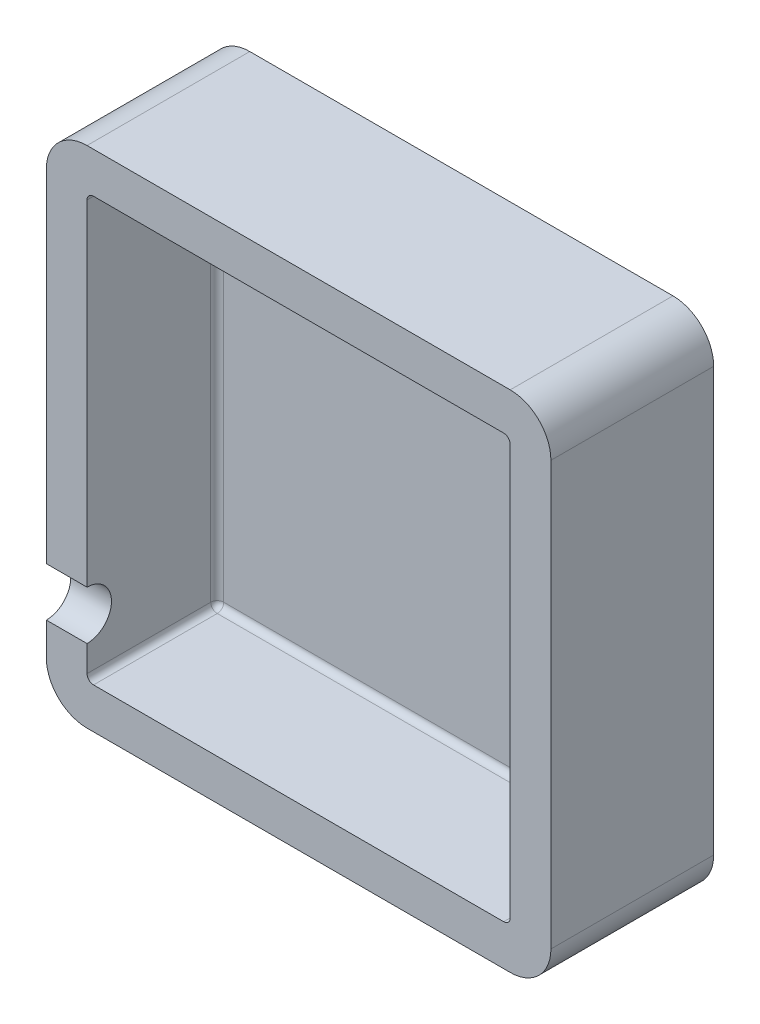
ISO-10303-21;
HEADER;
FILE_DESCRIPTION(('STEP AP214'),'2;1');
FILE_NAME('part.step','',(''),(''),'','','');
FILE_SCHEMA(('AUTOMOTIVE_DESIGN { 1 0 10303 214 1 1 1 1 }'));
ENDSEC;
DATA;
#1=APPLICATION_CONTEXT('core data for automotive mechanical design processes');
#2=APPLICATION_PROTOCOL_DEFINITION('international standard','automotive_design',2000,#1);
#3=PRODUCT_CONTEXT('',#1,'mechanical');
#4=PRODUCT('Part','Part','',(#3));
#5=PRODUCT_RELATED_PRODUCT_CATEGORY('part','',(#4));
#6=PRODUCT_DEFINITION_FORMATION('','',#4);
#7=PRODUCT_DEFINITION_CONTEXT('part definition',#1,'design');
#8=PRODUCT_DEFINITION('design','',#6,#7);
#9=PRODUCT_DEFINITION_SHAPE('','',#8);
#10=(LENGTH_UNIT() NAMED_UNIT(*) SI_UNIT(.MILLI.,.METRE.));
#11=(NAMED_UNIT(*) PLANE_ANGLE_UNIT() SI_UNIT($,.RADIAN.));
#12=(NAMED_UNIT(*) SI_UNIT($,.STERADIAN.) SOLID_ANGLE_UNIT());
#13=UNCERTAINTY_MEASURE_WITH_UNIT(LENGTH_MEASURE(1.E-05),#10,'distance_accuracy_value','');
#14=(GEOMETRIC_REPRESENTATION_CONTEXT(3) GLOBAL_UNCERTAINTY_ASSIGNED_CONTEXT((#13)) GLOBAL_UNIT_ASSIGNED_CONTEXT((#10,
#11,#12)) REPRESENTATION_CONTEXT('',''));
#15=CARTESIAN_POINT('',(0.,0.,0.));
#16=DIRECTION('',(0.,0.,1.));
#17=DIRECTION('',(1.,0.,0.));
#18=AXIS2_PLACEMENT_3D('',#15,#16,#17);
#19=CARTESIAN_POINT('',(0.,0.,8.));
#20=DIRECTION('',(0.,0.,1.));
#21=DIRECTION('',(1.,0.,0.));
#22=AXIS2_PLACEMENT_3D('',#19,#20,#21);
#23=PLANE('',#22);
#24=DIRECTION('',(-1.,0.,0.));
#25=VECTOR('',#24,1.);
#26=CARTESIAN_POINT('',(15.501,-8.,8.));
#27=LINE('',#26,#25);
#28=CARTESIAN_POINT('',(-15.5,-8.,8.));
#29=VERTEX_POINT('',#28);
#30=CARTESIAN_POINT('',(-13.,-8.,8.));
#31=VERTEX_POINT('',#30);
#32=EDGE_CURVE('E196',#29,#31,#27,.F.);
#33=ORIENTED_EDGE('',*,*,#32,.T.);
#34=DIRECTION('',(0.,-1.,0.));
#35=VECTOR('',#34,1.);
#36=CARTESIAN_POINT('',(-13.,-13.,8.));
#37=LINE('',#36,#35);
#38=CARTESIAN_POINT('',(-13.,12.6,8.));
#39=VERTEX_POINT('',#38);
#40=EDGE_CURVE('E355',#39,#31,#37,.T.);
#41=ORIENTED_EDGE('',*,*,#40,.F.);
#42=CARTESIAN_POINT('',(-12.6,12.6,8.));
#43=DIRECTION('',(0.,0.,1.));
#44=DIRECTION('',(1.,0.,0.));
#45=AXIS2_PLACEMENT_3D('',#42,#43,#44);
#46=CIRCLE('',#45,0.4);
#47=CARTESIAN_POINT('',(-12.6,13.,8.));
#48=VERTEX_POINT('',#47);
#49=EDGE_CURVE('E12',#39,#48,#46,.F.);
#50=ORIENTED_EDGE('',*,*,#49,.T.);
#51=DIRECTION('',(-1.,0.,0.));
#52=VECTOR('',#51,1.);
#53=CARTESIAN_POINT('',(13.,13.,8.));
#54=LINE('',#53,#52);
#55=CARTESIAN_POINT('',(12.6,13.,8.));
#56=VERTEX_POINT('',#55);
#57=EDGE_CURVE('E216',#56,#48,#54,.T.);
#58=ORIENTED_EDGE('',*,*,#57,.F.);
#59=CARTESIAN_POINT('',(12.6,12.6,8.));
#60=DIRECTION('',(0.,0.,1.));
#61=DIRECTION('',(1.,0.,0.));
#62=AXIS2_PLACEMENT_3D('',#59,#60,#61);
#63=CIRCLE('',#62,0.4);
#64=CARTESIAN_POINT('',(13.,12.6,8.));
#65=VERTEX_POINT('',#64);
#66=EDGE_CURVE('E66',#56,#65,#63,.F.);
#67=ORIENTED_EDGE('',*,*,#66,.T.);
#68=DIRECTION('',(0.,1.,0.));
#69=VECTOR('',#68,1.);
#70=CARTESIAN_POINT('',(13.,-13.,8.));
#71=LINE('',#70,#69);
#72=CARTESIAN_POINT('',(13.,-12.6,8.));
#73=VERTEX_POINT('',#72);
#74=EDGE_CURVE('E220',#73,#65,#71,.T.);
#75=ORIENTED_EDGE('',*,*,#74,.F.);
#76=CARTESIAN_POINT('',(12.6,-12.6,8.));
#77=DIRECTION('',(0.,0.,1.));
#78=DIRECTION('',(1.,0.,0.));
#79=AXIS2_PLACEMENT_3D('',#76,#77,#78);
#80=CIRCLE('',#79,0.4);
#81=CARTESIAN_POINT('',(12.6,-13.,8.));
#82=VERTEX_POINT('',#81);
#83=EDGE_CURVE('E302',#73,#82,#80,.F.);
#84=ORIENTED_EDGE('',*,*,#83,.T.);
#85=DIRECTION('',(1.,0.,0.));
#86=VECTOR('',#85,1.);
#87=CARTESIAN_POINT('',(13.,-13.,8.));
#88=LINE('',#87,#86);
#89=CARTESIAN_POINT('',(-12.6,-13.,8.));
#90=VERTEX_POINT('',#89);
#91=EDGE_CURVE('E358',#90,#82,#88,.T.);
#92=ORIENTED_EDGE('',*,*,#91,.F.);
#93=CARTESIAN_POINT('',(-12.6,-12.6,8.));
#94=DIRECTION('',(0.,0.,1.));
#95=DIRECTION('',(1.,0.,0.));
#96=AXIS2_PLACEMENT_3D('',#93,#94,#95);
#97=CIRCLE('',#96,0.4);
#98=CARTESIAN_POINT('',(-13.,-12.6,8.));
#99=VERTEX_POINT('',#98);
#100=EDGE_CURVE('E300',#90,#99,#97,.F.);
#101=ORIENTED_EDGE('',*,*,#100,.T.);
#102=CARTESIAN_POINT('',(-13.,-11.,8.));
#103=VERTEX_POINT('',#102);
#104=EDGE_CURVE('E208',#103,#99,#37,.T.);
#105=ORIENTED_EDGE('',*,*,#104,.F.);
#106=DIRECTION('',(-1.,0.,0.));
#107=VECTOR('',#106,1.);
#108=CARTESIAN_POINT('',(15.501,-11.,8.));
#109=LINE('',#108,#107);
#110=CARTESIAN_POINT('',(-15.5,-11.,8.));
#111=VERTEX_POINT('',#110);
#112=EDGE_CURVE('E74',#103,#111,#109,.T.);
#113=ORIENTED_EDGE('',*,*,#112,.T.);
#114=DIRECTION('',(0.,-1.,0.));
#115=VECTOR('',#114,1.);
#116=CARTESIAN_POINT('',(-15.5,-13.,8.));
#117=LINE('',#116,#115);
#118=CARTESIAN_POINT('',(-15.5,-13.,8.));
#119=VERTEX_POINT('',#118);
#120=EDGE_CURVE('E205',#111,#119,#117,.T.);
#121=ORIENTED_EDGE('',*,*,#120,.T.);
#122=CARTESIAN_POINT('',(-13.,-13.,8.));
#123=DIRECTION('',(0.,0.,1.));
#124=DIRECTION('',(1.,0.,0.));
#125=AXIS2_PLACEMENT_3D('',#122,#123,#124);
#126=CIRCLE('',#125,2.5);
#127=CARTESIAN_POINT('',(-13.,-15.5,8.));
#128=VERTEX_POINT('',#127);
#129=EDGE_CURVE('E252',#119,#128,#126,.T.);
#130=ORIENTED_EDGE('',*,*,#129,.T.);
#131=DIRECTION('',(1.,0.,0.));
#132=VECTOR('',#131,1.);
#133=CARTESIAN_POINT('',(13.,-15.5,8.));
#134=LINE('',#133,#132);
#135=CARTESIAN_POINT('',(13.,-15.5,8.));
#136=VERTEX_POINT('',#135);
#137=EDGE_CURVE('E218',#128,#136,#134,.T.);
#138=ORIENTED_EDGE('',*,*,#137,.T.);
#139=CARTESIAN_POINT('',(13.,-13.,8.));
#140=DIRECTION('',(0.,0.,1.));
#141=DIRECTION('',(1.,0.,0.));
#142=AXIS2_PLACEMENT_3D('',#139,#140,#141);
#143=CIRCLE('',#142,2.5);
#144=CARTESIAN_POINT('',(15.5,-13.,8.));
#145=VERTEX_POINT('',#144);
#146=EDGE_CURVE('E254',#136,#145,#143,.T.);
#147=ORIENTED_EDGE('',*,*,#146,.T.);
#148=DIRECTION('',(0.,1.,0.));
#149=VECTOR('',#148,1.);
#150=CARTESIAN_POINT('',(15.5,-13.,8.));
#151=LINE('',#150,#149);
#152=CARTESIAN_POINT('',(15.5,13.,8.));
#153=VERTEX_POINT('',#152);
#154=EDGE_CURVE('E226',#145,#153,#151,.T.);
#155=ORIENTED_EDGE('',*,*,#154,.T.);
#156=CARTESIAN_POINT('',(13.,13.,8.));
#157=DIRECTION('',(0.,0.,1.));
#158=DIRECTION('',(1.,0.,0.));
#159=AXIS2_PLACEMENT_3D('',#156,#157,#158);
#160=CIRCLE('',#159,2.5);
#161=CARTESIAN_POINT('',(13.,15.5,8.));
#162=VERTEX_POINT('',#161);
#163=EDGE_CURVE('E256',#153,#162,#160,.T.);
#164=ORIENTED_EDGE('',*,*,#163,.T.);
#165=DIRECTION('',(-1.,0.,0.));
#166=VECTOR('',#165,1.);
#167=CARTESIAN_POINT('',(13.,15.5,8.));
#168=LINE('',#167,#166);
#169=CARTESIAN_POINT('',(-13.,15.5,8.));
#170=VERTEX_POINT('',#169);
#171=EDGE_CURVE('E229',#162,#170,#168,.T.);
#172=ORIENTED_EDGE('',*,*,#171,.T.);
#173=CARTESIAN_POINT('',(-13.,13.,8.));
#174=DIRECTION('',(0.,0.,1.));
#175=DIRECTION('',(1.,0.,0.));
#176=AXIS2_PLACEMENT_3D('',#173,#174,#175);
#177=CIRCLE('',#176,2.5);
#178=CARTESIAN_POINT('',(-15.5,13.,8.));
#179=VERTEX_POINT('',#178);
#180=EDGE_CURVE('E250',#170,#179,#177,.T.);
#181=ORIENTED_EDGE('',*,*,#180,.T.);
#182=EDGE_CURVE('E215',#179,#29,#117,.T.);
#183=ORIENTED_EDGE('',*,*,#182,.T.);
#184=EDGE_LOOP('',(#33,#41,#50,#58,#67,#75,#84,#92,#101,#105,#113,#121,#130,#138,#147,#155,#164,
#172,#181,#183));
#185=FACE_BOUND('',#184,.T.);
#186=ADVANCED_FACE('F57',(#185),#23,.T.);
#187=CARTESIAN_POINT('',(-15.5,-13.,8.));
#188=DIRECTION('',(1.,0.,0.));
#189=DIRECTION('',(0.,0.,-1.));
#190=AXIS2_PLACEMENT_3D('',#187,#188,#189);
#191=PLANE('',#190);
#192=ORIENTED_EDGE('',*,*,#120,.F.);
#193=CARTESIAN_POINT('',(-15.5,-9.5,8.));
#194=DIRECTION('',(-1.,0.,0.));
#195=DIRECTION('',(0.,0.,1.));
#196=AXIS2_PLACEMENT_3D('',#193,#194,#195);
#197=CIRCLE('',#196,1.5);
#198=EDGE_CURVE('E193',#29,#111,#197,.T.);
#199=ORIENTED_EDGE('',*,*,#198,.F.);
#200=ORIENTED_EDGE('',*,*,#182,.F.);
#201=DIRECTION('',(0.,0.,-1.));
#202=VECTOR('',#201,1.);
#203=CARTESIAN_POINT('',(-15.5,13.,8.));
#204=LINE('',#203,#202);
#205=CARTESIAN_POINT('',(-15.5,13.,-2.));
#206=VERTEX_POINT('',#205);
#207=EDGE_CURVE('E263',#179,#206,#204,.T.);
#208=ORIENTED_EDGE('',*,*,#207,.T.);
#209=DIRECTION('',(0.,1.,0.));
#210=VECTOR('',#209,1.);
#211=CARTESIAN_POINT('',(-15.5,15.5,-2.));
#212=LINE('',#211,#210);
#213=CARTESIAN_POINT('',(-15.5,-13.,-2.));
#214=VERTEX_POINT('',#213);
#215=EDGE_CURVE('E346',#214,#206,#212,.T.);
#216=ORIENTED_EDGE('',*,*,#215,.F.);
#217=DIRECTION('',(0.,0.,-1.));
#218=VECTOR('',#217,1.);
#219=CARTESIAN_POINT('',(-15.5,-13.,8.));
#220=LINE('',#219,#218);
#221=EDGE_CURVE('E213',#214,#119,#220,.F.);
#222=ORIENTED_EDGE('',*,*,#221,.T.);
#223=EDGE_LOOP('',(#192,#199,#200,#208,#216,#222));
#224=FACE_BOUND('',#223,.T.);
#225=ADVANCED_FACE('F210',(#224),#191,.F.);
#226=CARTESIAN_POINT('',(13.,-15.5,8.));
#227=DIRECTION('',(0.,1.,0.));
#228=DIRECTION('',(-1.,0.,0.));
#229=AXIS2_PLACEMENT_3D('',#226,#227,#228);
#230=PLANE('',#229);
#231=DIRECTION('',(-1.,0.,0.));
#232=VECTOR('',#231,1.);
#233=CARTESIAN_POINT('',(15.5,-15.5,-2.));
#234=LINE('',#233,#232);
#235=CARTESIAN_POINT('',(13.,-15.5,-2.));
#236=VERTEX_POINT('',#235);
#237=CARTESIAN_POINT('',(-13.,-15.5,-2.));
#238=VERTEX_POINT('',#237);
#239=EDGE_CURVE('E341',#236,#238,#234,.T.);
#240=ORIENTED_EDGE('',*,*,#239,.F.);
#241=DIRECTION('',(0.,0.,-1.));
#242=VECTOR('',#241,1.);
#243=CARTESIAN_POINT('',(13.,-15.5,8.));
#244=LINE('',#243,#242);
#245=EDGE_CURVE('E261',#236,#136,#244,.F.);
#246=ORIENTED_EDGE('',*,*,#245,.T.);
#247=ORIENTED_EDGE('',*,*,#137,.F.);
#248=DIRECTION('',(0.,0.,-1.));
#249=VECTOR('',#248,1.);
#250=CARTESIAN_POINT('',(-13.,-15.5,8.));
#251=LINE('',#250,#249);
#252=EDGE_CURVE('E258',#128,#238,#251,.T.);
#253=ORIENTED_EDGE('',*,*,#252,.T.);
#254=EDGE_LOOP('',(#240,#246,#247,#253));
#255=FACE_BOUND('',#254,.T.);
#256=ADVANCED_FACE('F406',(#255),#230,.F.);
#257=CARTESIAN_POINT('',(15.5,-13.,8.));
#258=DIRECTION('',(-1.,0.,0.));
#259=DIRECTION('',(0.,0.,1.));
#260=AXIS2_PLACEMENT_3D('',#257,#258,#259);
#261=PLANE('',#260);
#262=DIRECTION('',(0.,-1.,0.));
#263=VECTOR('',#262,1.);
#264=CARTESIAN_POINT('',(15.5,15.5,-2.));
#265=LINE('',#264,#263);
#266=CARTESIAN_POINT('',(15.5,13.,-2.));
#267=VERTEX_POINT('',#266);
#268=CARTESIAN_POINT('',(15.5,-13.,-2.));
#269=VERTEX_POINT('',#268);
#270=EDGE_CURVE('E338',#267,#269,#265,.T.);
#271=ORIENTED_EDGE('',*,*,#270,.F.);
#272=DIRECTION('',(0.,0.,-1.));
#273=VECTOR('',#272,1.);
#274=CARTESIAN_POINT('',(15.5,13.,8.));
#275=LINE('',#274,#273);
#276=EDGE_CURVE('E248',#267,#153,#275,.F.);
#277=ORIENTED_EDGE('',*,*,#276,.T.);
#278=ORIENTED_EDGE('',*,*,#154,.F.);
#279=DIRECTION('',(0.,0.,-1.));
#280=VECTOR('',#279,1.);
#281=CARTESIAN_POINT('',(15.5,-13.,8.));
#282=LINE('',#281,#280);
#283=EDGE_CURVE('E245',#145,#269,#282,.T.);
#284=ORIENTED_EDGE('',*,*,#283,.T.);
#285=EDGE_LOOP('',(#271,#277,#278,#284));
#286=FACE_BOUND('',#285,.T.);
#287=ADVANCED_FACE('F415',(#286),#261,.F.);
#288=CARTESIAN_POINT('',(13.,15.5,8.));
#289=DIRECTION('',(0.,-1.,0.));
#290=DIRECTION('',(1.,0.,0.));
#291=AXIS2_PLACEMENT_3D('',#288,#289,#290);
#292=PLANE('',#291);
#293=ORIENTED_EDGE('',*,*,#171,.F.);
#294=DIRECTION('',(0.,0.,-1.));
#295=VECTOR('',#294,1.);
#296=CARTESIAN_POINT('',(13.,15.5,8.));
#297=LINE('',#296,#295);
#298=CARTESIAN_POINT('',(13.,15.5,-2.));
#299=VERTEX_POINT('',#298);
#300=EDGE_CURVE('E234',#162,#299,#297,.T.);
#301=ORIENTED_EDGE('',*,*,#300,.T.);
#302=DIRECTION('',(1.,0.,0.));
#303=VECTOR('',#302,1.);
#304=CARTESIAN_POINT('',(15.5,15.5,-2.));
#305=LINE('',#304,#303);
#306=CARTESIAN_POINT('',(-13.,15.5,-2.));
#307=VERTEX_POINT('',#306);
#308=EDGE_CURVE('E352',#307,#299,#305,.T.);
#309=ORIENTED_EDGE('',*,*,#308,.F.);
#310=DIRECTION('',(0.,0.,-1.));
#311=VECTOR('',#310,1.);
#312=CARTESIAN_POINT('',(-13.,15.5,8.));
#313=LINE('',#312,#311);
#314=EDGE_CURVE('E232',#307,#170,#313,.F.);
#315=ORIENTED_EDGE('',*,*,#314,.T.);
#316=EDGE_LOOP('',(#293,#301,#309,#315));
#317=FACE_BOUND('',#316,.T.);
#318=ADVANCED_FACE('F412',(#317),#292,.F.);
#319=CARTESIAN_POINT('',(-13.,-13.,8.));
#320=DIRECTION('',(1.,0.,0.));
#321=DIRECTION('',(0.,0.,-1.));
#322=AXIS2_PLACEMENT_3D('',#319,#320,#321);
#323=PLANE('',#322);
#324=CARTESIAN_POINT('',(-13.,-9.5,8.));
#325=DIRECTION('',(1.,0.,0.));
#326=DIRECTION('',(0.,0.,-1.));
#327=AXIS2_PLACEMENT_3D('',#324,#325,#326);
#328=CIRCLE('',#327,1.5);
#329=EDGE_CURVE('E201',#31,#103,#328,.F.);
#330=ORIENTED_EDGE('',*,*,#329,.T.);
#331=ORIENTED_EDGE('',*,*,#104,.T.);
#332=DIRECTION('',(0.,0.,-1.));
#333=VECTOR('',#332,1.);
#334=CARTESIAN_POINT('',(-13.,-12.6,0.));
#335=LINE('',#334,#333);
#336=CARTESIAN_POINT('',(-13.,-12.6,0.4));
#337=VERTEX_POINT('',#336);
#338=EDGE_CURVE('E281',#99,#337,#335,.T.);
#339=ORIENTED_EDGE('',*,*,#338,.T.);
#340=DIRECTION('',(0.,-1.,0.));
#341=VECTOR('',#340,1.);
#342=CARTESIAN_POINT('',(-13.,-13.,0.4));
#343=LINE('',#342,#341);
#344=CARTESIAN_POINT('',(-13.,12.6,0.4));
#345=VERTEX_POINT('',#344);
#346=EDGE_CURVE('E278',#337,#345,#343,.F.);
#347=ORIENTED_EDGE('',*,*,#346,.T.);
#348=DIRECTION('',(0.,0.,-1.));
#349=VECTOR('',#348,1.);
#350=CARTESIAN_POINT('',(-13.,12.6,8.));
#351=LINE('',#350,#349);
#352=EDGE_CURVE('E276',#345,#39,#351,.F.);
#353=ORIENTED_EDGE('',*,*,#352,.T.);
#354=ORIENTED_EDGE('',*,*,#40,.T.);
#355=EDGE_LOOP('',(#330,#331,#339,#347,#353,#354));
#356=FACE_BOUND('',#355,.T.);
#357=ADVANCED_FACE('F410',(#356),#323,.T.);
#358=CARTESIAN_POINT('',(13.,-13.,8.));
#359=DIRECTION('',(0.,1.,0.));
#360=DIRECTION('',(-1.,0.,0.));
#361=AXIS2_PLACEMENT_3D('',#358,#359,#360);
#362=PLANE('',#361);
#363=DIRECTION('',(1.,0.,0.));
#364=VECTOR('',#363,1.);
#365=CARTESIAN_POINT('',(13.,-13.,0.4));
#366=LINE('',#365,#364);
#367=CARTESIAN_POINT('',(12.6,-13.,0.4));
#368=VERTEX_POINT('',#367);
#369=CARTESIAN_POINT('',(-12.6,-13.,0.4));
#370=VERTEX_POINT('',#369);
#371=EDGE_CURVE('E82',#368,#370,#366,.F.);
#372=ORIENTED_EDGE('',*,*,#371,.T.);
#373=DIRECTION('',(0.,0.,-1.));
#374=VECTOR('',#373,1.);
#375=CARTESIAN_POINT('',(-12.6,-13.,8.));
#376=LINE('',#375,#374);
#377=EDGE_CURVE('E298',#370,#90,#376,.F.);
#378=ORIENTED_EDGE('',*,*,#377,.T.);
#379=ORIENTED_EDGE('',*,*,#91,.T.);
#380=DIRECTION('',(0.,0.,-1.));
#381=VECTOR('',#380,1.);
#382=CARTESIAN_POINT('',(12.6,-13.,0.));
#383=LINE('',#382,#381);
#384=EDGE_CURVE('E295',#82,#368,#383,.T.);
#385=ORIENTED_EDGE('',*,*,#384,.T.);
#386=EDGE_LOOP('',(#372,#378,#379,#385));
#387=FACE_BOUND('',#386,.T.);
#388=ADVANCED_FACE('F506',(#387),#362,.T.);
#389=CARTESIAN_POINT('',(13.,-13.,8.));
#390=DIRECTION('',(-1.,0.,0.));
#391=DIRECTION('',(0.,0.,1.));
#392=AXIS2_PLACEMENT_3D('',#389,#390,#391);
#393=PLANE('',#392);
#394=DIRECTION('',(0.,1.,0.));
#395=VECTOR('',#394,1.);
#396=CARTESIAN_POINT('',(13.,-13.,0.4));
#397=LINE('',#396,#395);
#398=CARTESIAN_POINT('',(13.,12.6,0.4));
#399=VERTEX_POINT('',#398);
#400=CARTESIAN_POINT('',(13.,-12.6,0.4));
#401=VERTEX_POINT('',#400);
#402=EDGE_CURVE('E291',#399,#401,#397,.F.);
#403=ORIENTED_EDGE('',*,*,#402,.T.);
#404=DIRECTION('',(0.,0.,-1.));
#405=VECTOR('',#404,1.);
#406=CARTESIAN_POINT('',(13.,-12.6,8.));
#407=LINE('',#406,#405);
#408=EDGE_CURVE('E293',#401,#73,#407,.F.);
#409=ORIENTED_EDGE('',*,*,#408,.T.);
#410=ORIENTED_EDGE('',*,*,#74,.T.);
#411=DIRECTION('',(0.,0.,-1.));
#412=VECTOR('',#411,1.);
#413=CARTESIAN_POINT('',(13.,12.6,0.));
#414=LINE('',#413,#412);
#415=EDGE_CURVE('E289',#65,#399,#414,.T.);
#416=ORIENTED_EDGE('',*,*,#415,.T.);
#417=EDGE_LOOP('',(#403,#409,#410,#416));
#418=FACE_BOUND('',#417,.T.);
#419=ADVANCED_FACE('F364',(#418),#393,.T.);
#420=CARTESIAN_POINT('',(13.,13.,8.));
#421=DIRECTION('',(0.,-1.,0.));
#422=DIRECTION('',(1.,0.,0.));
#423=AXIS2_PLACEMENT_3D('',#420,#421,#422);
#424=PLANE('',#423);
#425=DIRECTION('',(-1.,0.,0.));
#426=VECTOR('',#425,1.);
#427=CARTESIAN_POINT('',(13.,13.,0.4));
#428=LINE('',#427,#426);
#429=CARTESIAN_POINT('',(-12.6,13.,0.4));
#430=VERTEX_POINT('',#429);
#431=CARTESIAN_POINT('',(12.6,13.,0.4));
#432=VERTEX_POINT('',#431);
#433=EDGE_CURVE('E285',#430,#432,#428,.F.);
#434=ORIENTED_EDGE('',*,*,#433,.T.);
#435=DIRECTION('',(0.,0.,-1.));
#436=VECTOR('',#435,1.);
#437=CARTESIAN_POINT('',(12.6,13.,8.));
#438=LINE('',#437,#436);
#439=EDGE_CURVE('E287',#432,#56,#438,.F.);
#440=ORIENTED_EDGE('',*,*,#439,.T.);
#441=ORIENTED_EDGE('',*,*,#57,.T.);
#442=DIRECTION('',(0.,0.,-1.));
#443=VECTOR('',#442,1.);
#444=CARTESIAN_POINT('',(-12.6,13.,0.));
#445=LINE('',#444,#443);
#446=EDGE_CURVE('E283',#48,#430,#445,.T.);
#447=ORIENTED_EDGE('',*,*,#446,.T.);
#448=EDGE_LOOP('',(#434,#440,#441,#447));
#449=FACE_BOUND('',#448,.T.);
#450=ADVANCED_FACE('F373',(#449),#424,.T.);
#451=CARTESIAN_POINT('',(0.,0.,0.));
#452=DIRECTION('',(0.,0.,-1.));
#453=DIRECTION('',(-1.,0.,0.));
#454=AXIS2_PLACEMENT_3D('',#451,#452,#453);
#455=PLANE('',#454);
#456=DIRECTION('',(-1.,0.,0.));
#457=VECTOR('',#456,1.);
#458=CARTESIAN_POINT('',(0.,12.6,0.));
#459=LINE('',#458,#457);
#460=CARTESIAN_POINT('',(12.6,12.6,0.));
#461=VERTEX_POINT('',#460);
#462=CARTESIAN_POINT('',(-12.6,12.6,0.));
#463=VERTEX_POINT('',#462);
#464=EDGE_CURVE('E271',#461,#463,#459,.T.);
#465=ORIENTED_EDGE('',*,*,#464,.T.);
#466=DIRECTION('',(0.,-1.,0.));
#467=VECTOR('',#466,1.);
#468=CARTESIAN_POINT('',(-12.6,0.,0.));
#469=LINE('',#468,#467);
#470=CARTESIAN_POINT('',(-12.6,-12.6,0.));
#471=VERTEX_POINT('',#470);
#472=EDGE_CURVE('E273',#463,#471,#469,.T.);
#473=ORIENTED_EDGE('',*,*,#472,.T.);
#474=DIRECTION('',(1.,0.,0.));
#475=VECTOR('',#474,1.);
#476=CARTESIAN_POINT('',(0.,-12.6,0.));
#477=LINE('',#476,#475);
#478=CARTESIAN_POINT('',(12.6,-12.6,0.));
#479=VERTEX_POINT('',#478);
#480=EDGE_CURVE('E267',#471,#479,#477,.T.);
#481=ORIENTED_EDGE('',*,*,#480,.T.);
#482=DIRECTION('',(0.,1.,0.));
#483=VECTOR('',#482,1.);
#484=CARTESIAN_POINT('',(12.6,0.,0.));
#485=LINE('',#484,#483);
#486=EDGE_CURVE('E269',#479,#461,#485,.T.);
#487=ORIENTED_EDGE('',*,*,#486,.T.);
#488=EDGE_LOOP('',(#465,#473,#481,#487));
#489=FACE_BOUND('',#488,.T.);
#490=ADVANCED_FACE('F550',(#489),#455,.F.);
#491=CARTESIAN_POINT('',(0.,0.,-2.));
#492=DIRECTION('',(0.,0.,-1.));
#493=DIRECTION('',(-1.,0.,0.));
#494=AXIS2_PLACEMENT_3D('',#491,#492,#493);
#495=PLANE('',#494);
#496=ORIENTED_EDGE('',*,*,#308,.T.);
#497=CARTESIAN_POINT('',(13.,13.,-2.));
#498=DIRECTION('',(0.,0.,-1.));
#499=DIRECTION('',(-1.,0.,0.));
#500=AXIS2_PLACEMENT_3D('',#497,#498,#499);
#501=CIRCLE('',#500,2.5);
#502=EDGE_CURVE('E243',#299,#267,#501,.T.);
#503=ORIENTED_EDGE('',*,*,#502,.T.);
#504=ORIENTED_EDGE('',*,*,#270,.T.);
#505=CARTESIAN_POINT('',(13.,-13.,-2.));
#506=DIRECTION('',(0.,0.,-1.));
#507=DIRECTION('',(-1.,0.,0.));
#508=AXIS2_PLACEMENT_3D('',#505,#506,#507);
#509=CIRCLE('',#508,2.5);
#510=EDGE_CURVE('E241',#269,#236,#509,.T.);
#511=ORIENTED_EDGE('',*,*,#510,.T.);
#512=ORIENTED_EDGE('',*,*,#239,.T.);
#513=CARTESIAN_POINT('',(-13.,-13.,-2.));
#514=DIRECTION('',(0.,0.,-1.));
#515=DIRECTION('',(-1.,0.,0.));
#516=AXIS2_PLACEMENT_3D('',#513,#514,#515);
#517=CIRCLE('',#516,2.5);
#518=EDGE_CURVE('E239',#238,#214,#517,.T.);
#519=ORIENTED_EDGE('',*,*,#518,.T.);
#520=ORIENTED_EDGE('',*,*,#215,.T.);
#521=CARTESIAN_POINT('',(-13.,13.,-2.));
#522=DIRECTION('',(0.,0.,-1.));
#523=DIRECTION('',(-1.,0.,0.));
#524=AXIS2_PLACEMENT_3D('',#521,#522,#523);
#525=CIRCLE('',#524,2.5);
#526=EDGE_CURVE('E237',#206,#307,#525,.T.);
#527=ORIENTED_EDGE('',*,*,#526,.T.);
#528=EDGE_LOOP('',(#496,#503,#504,#511,#512,#519,#520,#527));
#529=FACE_BOUND('',#528,.T.);
#530=ADVANCED_FACE('F427',(#529),#495,.T.);
#531=CARTESIAN_POINT('',(13.,13.,8.));
#532=DIRECTION('',(0.,0.,-1.));
#533=DIRECTION('',(-1.,0.,0.));
#534=AXIS2_PLACEMENT_3D('',#531,#532,#533);
#535=CYLINDRICAL_SURFACE('',#534,2.5);
#536=ORIENTED_EDGE('',*,*,#163,.F.);
#537=ORIENTED_EDGE('',*,*,#276,.F.);
#538=ORIENTED_EDGE('',*,*,#502,.F.);
#539=ORIENTED_EDGE('',*,*,#300,.F.);
#540=EDGE_LOOP('',(#536,#537,#538,#539));
#541=FACE_BOUND('',#540,.T.);
#542=ADVANCED_FACE('F423',(#541),#535,.T.);
#543=CARTESIAN_POINT('',(13.,-13.,8.));
#544=DIRECTION('',(0.,0.,-1.));
#545=DIRECTION('',(-1.,0.,0.));
#546=AXIS2_PLACEMENT_3D('',#543,#544,#545);
#547=CYLINDRICAL_SURFACE('',#546,2.5);
#548=ORIENTED_EDGE('',*,*,#146,.F.);
#549=ORIENTED_EDGE('',*,*,#245,.F.);
#550=ORIENTED_EDGE('',*,*,#510,.F.);
#551=ORIENTED_EDGE('',*,*,#283,.F.);
#552=EDGE_LOOP('',(#548,#549,#550,#551));
#553=FACE_BOUND('',#552,.T.);
#554=ADVANCED_FACE('F426',(#553),#547,.T.);
#555=CARTESIAN_POINT('',(-13.,-13.,8.));
#556=DIRECTION('',(0.,0.,-1.));
#557=DIRECTION('',(-1.,0.,0.));
#558=AXIS2_PLACEMENT_3D('',#555,#556,#557);
#559=CYLINDRICAL_SURFACE('',#558,2.5);
#560=ORIENTED_EDGE('',*,*,#129,.F.);
#561=ORIENTED_EDGE('',*,*,#221,.F.);
#562=ORIENTED_EDGE('',*,*,#518,.F.);
#563=ORIENTED_EDGE('',*,*,#252,.F.);
#564=EDGE_LOOP('',(#560,#561,#562,#563));
#565=FACE_BOUND('',#564,.T.);
#566=ADVANCED_FACE('F431',(#565),#559,.T.);
#567=CARTESIAN_POINT('',(-13.,13.,8.));
#568=DIRECTION('',(0.,0.,-1.));
#569=DIRECTION('',(-1.,0.,0.));
#570=AXIS2_PLACEMENT_3D('',#567,#568,#569);
#571=CYLINDRICAL_SURFACE('',#570,2.5);
#572=ORIENTED_EDGE('',*,*,#180,.F.);
#573=ORIENTED_EDGE('',*,*,#314,.F.);
#574=ORIENTED_EDGE('',*,*,#526,.F.);
#575=ORIENTED_EDGE('',*,*,#207,.F.);
#576=EDGE_LOOP('',(#572,#573,#574,#575));
#577=FACE_BOUND('',#576,.T.);
#578=ADVANCED_FACE('F435',(#577),#571,.T.);
#579=CARTESIAN_POINT('',(12.6,12.6,8.));
#580=DIRECTION('',(0.,0.,1.));
#581=DIRECTION('',(1.,0.,0.));
#582=AXIS2_PLACEMENT_3D('',#579,#580,#581);
#583=CYLINDRICAL_SURFACE('',#582,0.4);
#584=ORIENTED_EDGE('',*,*,#66,.F.);
#585=ORIENTED_EDGE('',*,*,#439,.F.);
#586=CARTESIAN_POINT('',(12.6,12.6,0.4));
#587=DIRECTION('',(0.,0.,1.));
#588=DIRECTION('',(1.,0.,0.));
#589=AXIS2_PLACEMENT_3D('',#586,#587,#588);
#590=CIRCLE('',#589,0.4);
#591=EDGE_CURVE('E61',#399,#432,#590,.T.);
#592=ORIENTED_EDGE('',*,*,#591,.F.);
#593=ORIENTED_EDGE('',*,*,#415,.F.);
#594=EDGE_LOOP('',(#584,#585,#592,#593));
#595=FACE_BOUND('',#594,.T.);
#596=ADVANCED_FACE('F59',(#595),#583,.F.);
#597=CARTESIAN_POINT('',(12.6,0.,0.4));
#598=DIRECTION('',(0.,1.,0.));
#599=DIRECTION('',(0.,0.,1.));
#600=AXIS2_PLACEMENT_3D('',#597,#598,#599);
#601=CYLINDRICAL_SURFACE('',#600,0.4);
#602=CARTESIAN_POINT('',(12.6,-12.6,0.4));
#603=DIRECTION('',(0.,1.,0.));
#604=DIRECTION('',(0.,0.,1.));
#605=AXIS2_PLACEMENT_3D('',#602,#603,#604);
#606=CIRCLE('',#605,0.4);
#607=EDGE_CURVE('E330',#401,#479,#606,.T.);
#608=ORIENTED_EDGE('',*,*,#607,.F.);
#609=ORIENTED_EDGE('',*,*,#402,.F.);
#610=CARTESIAN_POINT('',(12.6,12.6,0.4));
#611=DIRECTION('',(0.,-1.,0.));
#612=DIRECTION('',(1.,0.,0.));
#613=AXIS2_PLACEMENT_3D('',#610,#611,#612);
#614=CIRCLE('',#613,0.4);
#615=EDGE_CURVE('E332',#461,#399,#614,.T.);
#616=ORIENTED_EDGE('',*,*,#615,.F.);
#617=ORIENTED_EDGE('',*,*,#486,.F.);
#618=EDGE_LOOP('',(#608,#609,#616,#617));
#619=FACE_BOUND('',#618,.T.);
#620=ADVANCED_FACE('F398',(#619),#601,.F.);
#621=CARTESIAN_POINT('',(12.6,-12.6,8.));
#622=DIRECTION('',(0.,0.,1.));
#623=DIRECTION('',(1.,0.,0.));
#624=AXIS2_PLACEMENT_3D('',#621,#622,#623);
#625=CYLINDRICAL_SURFACE('',#624,0.4);
#626=ORIENTED_EDGE('',*,*,#83,.F.);
#627=ORIENTED_EDGE('',*,*,#408,.F.);
#628=CARTESIAN_POINT('',(12.6,-12.6,0.4));
#629=DIRECTION('',(0.,0.,1.));
#630=DIRECTION('',(1.,0.,0.));
#631=AXIS2_PLACEMENT_3D('',#628,#629,#630);
#632=CIRCLE('',#631,0.4);
#633=EDGE_CURVE('E327',#368,#401,#632,.T.);
#634=ORIENTED_EDGE('',*,*,#633,.F.);
#635=ORIENTED_EDGE('',*,*,#384,.F.);
#636=EDGE_LOOP('',(#626,#627,#634,#635));
#637=FACE_BOUND('',#636,.T.);
#638=ADVANCED_FACE('F390',(#637),#625,.F.);
#639=CARTESIAN_POINT('',(12.6,12.6,0.4));
#640=DIRECTION('',(0.,0.,1.));
#641=DIRECTION('',(1.,0.,0.));
#642=AXIS2_PLACEMENT_3D('',#639,#640,#641);
#643=SPHERICAL_SURFACE('',#642,0.4);
#644=ORIENTED_EDGE('',*,*,#615,.T.);
#645=ORIENTED_EDGE('',*,*,#591,.T.);
#646=CARTESIAN_POINT('',(12.6,12.6,0.4));
#647=DIRECTION('',(-1.,0.,0.));
#648=DIRECTION('',(0.,0.,1.));
#649=AXIS2_PLACEMENT_3D('',#646,#647,#648);
#650=CIRCLE('',#649,0.4);
#651=EDGE_CURVE('E324',#461,#432,#650,.F.);
#652=ORIENTED_EDGE('',*,*,#651,.F.);
#653=EDGE_LOOP('',(#644,#645,#652));
#654=FACE_BOUND('',#653,.T.);
#655=ADVANCED_FACE('F387',(#654),#643,.F.);
#656=CARTESIAN_POINT('',(12.6,-12.6,0.4));
#657=DIRECTION('',(0.,0.,1.));
#658=DIRECTION('',(1.,0.,0.));
#659=AXIS2_PLACEMENT_3D('',#656,#657,#658);
#660=SPHERICAL_SURFACE('',#659,0.4);
#661=ORIENTED_EDGE('',*,*,#633,.T.);
#662=ORIENTED_EDGE('',*,*,#607,.T.);
#663=CARTESIAN_POINT('',(12.6,-12.6,0.4));
#664=DIRECTION('',(-1.,0.,0.));
#665=DIRECTION('',(0.,0.,1.));
#666=AXIS2_PLACEMENT_3D('',#663,#664,#665);
#667=CIRCLE('',#666,0.4);
#668=EDGE_CURVE('E321',#368,#479,#667,.F.);
#669=ORIENTED_EDGE('',*,*,#668,.F.);
#670=EDGE_LOOP('',(#661,#662,#669));
#671=FACE_BOUND('',#670,.T.);
#672=ADVANCED_FACE('F389',(#671),#660,.F.);
#673=CARTESIAN_POINT('',(-12.6,12.6,8.));
#674=DIRECTION('',(0.,0.,1.));
#675=DIRECTION('',(1.,0.,0.));
#676=AXIS2_PLACEMENT_3D('',#673,#674,#675);
#677=CYLINDRICAL_SURFACE('',#676,0.4);
#678=ORIENTED_EDGE('',*,*,#49,.F.);
#679=ORIENTED_EDGE('',*,*,#352,.F.);
#680=CARTESIAN_POINT('',(-12.6,12.6,0.4));
#681=DIRECTION('',(0.,0.,1.));
#682=DIRECTION('',(1.,0.,0.));
#683=AXIS2_PLACEMENT_3D('',#680,#681,#682);
#684=CIRCLE('',#683,0.4);
#685=EDGE_CURVE('E318',#430,#345,#684,.T.);
#686=ORIENTED_EDGE('',*,*,#685,.F.);
#687=ORIENTED_EDGE('',*,*,#446,.F.);
#688=EDGE_LOOP('',(#678,#679,#686,#687));
#689=FACE_BOUND('',#688,.T.);
#690=ADVANCED_FACE('F380',(#689),#677,.F.);
#691=CARTESIAN_POINT('',(0.,12.6,0.4));
#692=DIRECTION('',(-1.,0.,0.));
#693=DIRECTION('',(0.,-1.,0.));
#694=AXIS2_PLACEMENT_3D('',#691,#692,#693);
#695=CYLINDRICAL_SURFACE('',#694,0.4);
#696=ORIENTED_EDGE('',*,*,#651,.T.);
#697=ORIENTED_EDGE('',*,*,#433,.F.);
#698=CARTESIAN_POINT('',(-12.6,12.6,0.4));
#699=DIRECTION('',(1.,0.,0.));
#700=DIRECTION('',(0.,1.,0.));
#701=AXIS2_PLACEMENT_3D('',#698,#699,#700);
#702=CIRCLE('',#701,0.4);
#703=EDGE_CURVE('E315',#463,#430,#702,.T.);
#704=ORIENTED_EDGE('',*,*,#703,.F.);
#705=ORIENTED_EDGE('',*,*,#464,.F.);
#706=EDGE_LOOP('',(#696,#697,#704,#705));
#707=FACE_BOUND('',#706,.T.);
#708=ADVANCED_FACE('F384',(#707),#695,.F.);
#709=CARTESIAN_POINT('',(0.,-12.6,0.4));
#710=DIRECTION('',(1.,0.,0.));
#711=DIRECTION('',(0.,1.,0.));
#712=AXIS2_PLACEMENT_3D('',#709,#710,#711);
#713=CYLINDRICAL_SURFACE('',#712,0.4);
#714=ORIENTED_EDGE('',*,*,#668,.T.);
#715=ORIENTED_EDGE('',*,*,#480,.F.);
#716=CARTESIAN_POINT('',(-12.6,-12.6,0.4));
#717=DIRECTION('',(1.,0.,0.));
#718=DIRECTION('',(0.,0.,-1.));
#719=AXIS2_PLACEMENT_3D('',#716,#717,#718);
#720=CIRCLE('',#719,0.4);
#721=EDGE_CURVE('E312',#370,#471,#720,.T.);
#722=ORIENTED_EDGE('',*,*,#721,.F.);
#723=ORIENTED_EDGE('',*,*,#371,.F.);
#724=EDGE_LOOP('',(#714,#715,#722,#723));
#725=FACE_BOUND('',#724,.T.);
#726=ADVANCED_FACE('F455',(#725),#713,.F.);
#727=CARTESIAN_POINT('',(-12.6,-12.6,8.));
#728=DIRECTION('',(0.,0.,1.));
#729=DIRECTION('',(1.,0.,0.));
#730=AXIS2_PLACEMENT_3D('',#727,#728,#729);
#731=CYLINDRICAL_SURFACE('',#730,0.4);
#732=ORIENTED_EDGE('',*,*,#100,.F.);
#733=ORIENTED_EDGE('',*,*,#377,.F.);
#734=CARTESIAN_POINT('',(-12.6,-12.6,0.4));
#735=DIRECTION('',(0.,0.,1.));
#736=DIRECTION('',(1.,0.,0.));
#737=AXIS2_PLACEMENT_3D('',#734,#735,#736);
#738=CIRCLE('',#737,0.4);
#739=EDGE_CURVE('E309',#337,#370,#738,.T.);
#740=ORIENTED_EDGE('',*,*,#739,.F.);
#741=ORIENTED_EDGE('',*,*,#338,.F.);
#742=EDGE_LOOP('',(#732,#733,#740,#741));
#743=FACE_BOUND('',#742,.T.);
#744=ADVANCED_FACE('F451',(#743),#731,.F.);
#745=CARTESIAN_POINT('',(-12.6,12.6,0.4));
#746=DIRECTION('',(0.,0.,1.));
#747=DIRECTION('',(1.,0.,0.));
#748=AXIS2_PLACEMENT_3D('',#745,#746,#747);
#749=SPHERICAL_SURFACE('',#748,0.4);
#750=ORIENTED_EDGE('',*,*,#703,.T.);
#751=ORIENTED_EDGE('',*,*,#685,.T.);
#752=CARTESIAN_POINT('',(-12.6,12.6,0.4));
#753=DIRECTION('',(0.,-1.,0.));
#754=DIRECTION('',(0.,0.,-1.));
#755=AXIS2_PLACEMENT_3D('',#752,#753,#754);
#756=CIRCLE('',#755,0.4);
#757=EDGE_CURVE('E307',#463,#345,#756,.F.);
#758=ORIENTED_EDGE('',*,*,#757,.F.);
#759=EDGE_LOOP('',(#750,#751,#758));
#760=FACE_BOUND('',#759,.T.);
#761=ADVANCED_FACE('F447',(#760),#749,.F.);
#762=CARTESIAN_POINT('',(-12.6,-12.6,0.4));
#763=DIRECTION('',(0.,0.,1.));
#764=DIRECTION('',(1.,0.,0.));
#765=AXIS2_PLACEMENT_3D('',#762,#763,#764);
#766=SPHERICAL_SURFACE('',#765,0.4);
#767=ORIENTED_EDGE('',*,*,#739,.T.);
#768=ORIENTED_EDGE('',*,*,#721,.T.);
#769=CARTESIAN_POINT('',(-12.6,-12.6,0.4));
#770=DIRECTION('',(0.,1.,0.));
#771=DIRECTION('',(0.,0.,1.));
#772=AXIS2_PLACEMENT_3D('',#769,#770,#771);
#773=CIRCLE('',#772,0.4);
#774=EDGE_CURVE('E305',#337,#471,#773,.F.);
#775=ORIENTED_EDGE('',*,*,#774,.F.);
#776=EDGE_LOOP('',(#767,#768,#775));
#777=FACE_BOUND('',#776,.T.);
#778=ADVANCED_FACE('F443',(#777),#766,.F.);
#779=CARTESIAN_POINT('',(-12.6,0.,0.4));
#780=DIRECTION('',(0.,-1.,0.));
#781=DIRECTION('',(0.,0.,-1.));
#782=AXIS2_PLACEMENT_3D('',#779,#780,#781);
#783=CYLINDRICAL_SURFACE('',#782,0.4);
#784=ORIENTED_EDGE('',*,*,#757,.T.);
#785=ORIENTED_EDGE('',*,*,#346,.F.);
#786=ORIENTED_EDGE('',*,*,#774,.T.);
#787=ORIENTED_EDGE('',*,*,#472,.F.);
#788=EDGE_LOOP('',(#784,#785,#786,#787));
#789=FACE_BOUND('',#788,.T.);
#790=ADVANCED_FACE('F440',(#789),#783,.F.);
#791=CARTESIAN_POINT('',(15.501,-9.5,8.));
#792=DIRECTION('',(-1.,0.,0.));
#793=DIRECTION('',(0.,0.,1.));
#794=AXIS2_PLACEMENT_3D('',#791,#792,#793);
#795=CYLINDRICAL_SURFACE('',#794,1.5);
#796=ORIENTED_EDGE('',*,*,#198,.T.);
#797=ORIENTED_EDGE('',*,*,#112,.F.);
#798=ORIENTED_EDGE('',*,*,#329,.F.);
#799=ORIENTED_EDGE('',*,*,#32,.F.);
#800=EDGE_LOOP('',(#796,#797,#798,#799));
#801=FACE_BOUND('',#800,.T.);
#802=ADVANCED_FACE('F194',(#801),#795,.F.);
#803=CLOSED_SHELL('',(#186,#225,#256,#287,#318,#357,#388,#419,#450,#490,#530,#542,#554,#566,
#578,#596,#620,#638,#655,#672,#690,#708,#726,#744,#761,#778,#790,#802));
#804=MANIFOLD_SOLID_BREP('B2',#803);
#805=ADVANCED_BREP_SHAPE_REPRESENTATION('',(#18,#804),#14);
#806=SHAPE_DEFINITION_REPRESENTATION(#9,#805);
ENDSEC;
END-ISO-10303-21;
